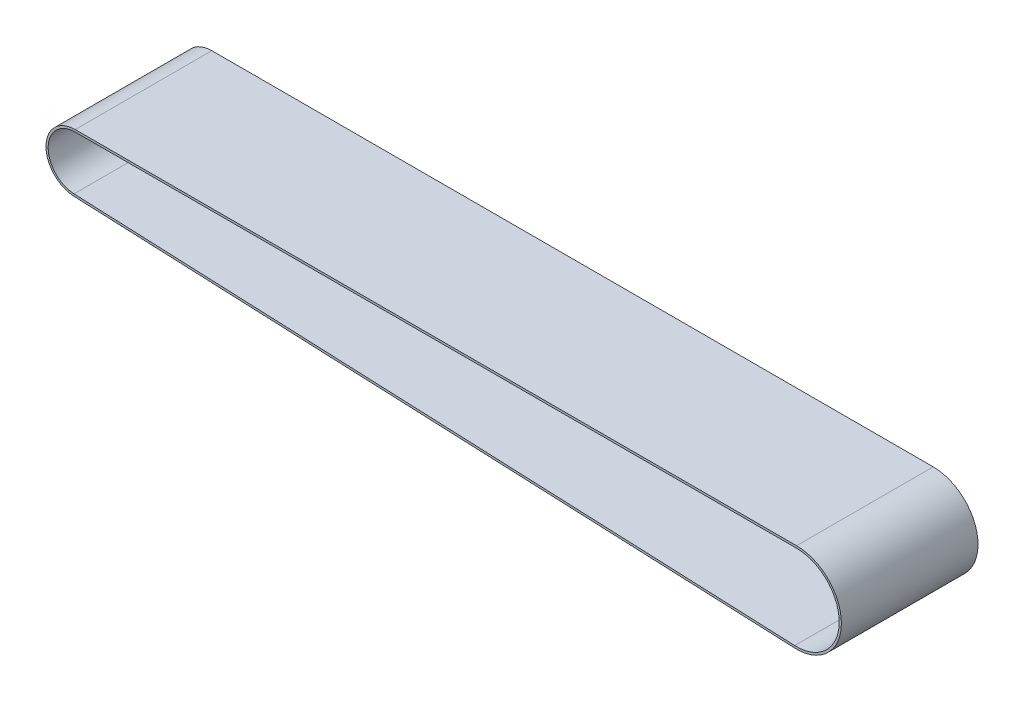
ISO-10303-21;
HEADER;
FILE_DESCRIPTION(('STEP AP214'),'2;1');
FILE_NAME('part.step','',(''),(''),'','','');
FILE_SCHEMA(('AUTOMOTIVE_DESIGN { 1 0 10303 214 1 1 1 1 }'));
ENDSEC;
DATA;
#1=APPLICATION_CONTEXT('core data for automotive mechanical design processes');
#2=APPLICATION_PROTOCOL_DEFINITION('international standard','automotive_design',2000,#1);
#3=PRODUCT_CONTEXT('',#1,'mechanical');
#4=PRODUCT('Part','Part','',(#3));
#5=PRODUCT_RELATED_PRODUCT_CATEGORY('part','',(#4));
#6=PRODUCT_DEFINITION_FORMATION('','',#4);
#7=PRODUCT_DEFINITION_CONTEXT('part definition',#1,'design');
#8=PRODUCT_DEFINITION('design','',#6,#7);
#9=PRODUCT_DEFINITION_SHAPE('','',#8);
#10=(LENGTH_UNIT() NAMED_UNIT(*) SI_UNIT(.MILLI.,.METRE.));
#11=(NAMED_UNIT(*) PLANE_ANGLE_UNIT() SI_UNIT($,.RADIAN.));
#12=(NAMED_UNIT(*) SI_UNIT($,.STERADIAN.) SOLID_ANGLE_UNIT());
#13=UNCERTAINTY_MEASURE_WITH_UNIT(LENGTH_MEASURE(1.E-05),#10,'distance_accuracy_value','');
#14=(GEOMETRIC_REPRESENTATION_CONTEXT(3) GLOBAL_UNCERTAINTY_ASSIGNED_CONTEXT((#13)) GLOBAL_UNIT_ASSIGNED_CONTEXT((#10,
#11,#12)) REPRESENTATION_CONTEXT('',''));
#15=CARTESIAN_POINT('',(0.,0.,0.));
#16=DIRECTION('',(0.,0.,1.));
#17=DIRECTION('',(1.,0.,0.));
#18=AXIS2_PLACEMENT_3D('',#15,#16,#17);
#19=CARTESIAN_POINT('',(-3.27546878509111E-08,6.84001466577655E-12,62.5));
#20=DIRECTION('',(0.,0.,-1.));
#21=DIRECTION('',(-1.,0.,0.));
#22=AXIS2_PLACEMENT_3D('',#19,#20,#21);
#23=CYLINDRICAL_SURFACE('',#22,26.75);
#24=CARTESIAN_POINT('',(-3.27546878509111E-08,6.84001466577655E-12,-62.5));
#25=DIRECTION('',(0.,0.,-1.));
#26=DIRECTION('',(-1.,0.,0.));
#27=AXIS2_PLACEMENT_3D('',#24,#25,#26);
#28=CIRCLE('',#27,26.75);
#29=CARTESIAN_POINT('',(-1.14446153825287,-26.7255066904646,-62.5));
#30=VERTEX_POINT('',#29);
#31=CARTESIAN_POINT('',(-0.0101326492200648,26.7499980809429,-62.5));
#32=VERTEX_POINT('',#31);
#33=EDGE_CURVE('E157',#30,#32,#28,.T.);
#34=ORIENTED_EDGE('',*,*,#33,.F.);
#35=DIRECTION('',(0.,0.,-1.));
#36=VECTOR('',#35,1.);
#37=CARTESIAN_POINT('',(-1.14446153825287,-26.7255066904646,62.5));
#38=LINE('',#37,#36);
#39=CARTESIAN_POINT('',(-1.14446153825287,-26.7255066904646,62.5));
#40=VERTEX_POINT('',#39);
#41=EDGE_CURVE('E12',#40,#30,#38,.T.);
#42=ORIENTED_EDGE('',*,*,#41,.F.);
#43=CARTESIAN_POINT('',(-3.27546878509111E-08,6.84001466577655E-12,62.5));
#44=DIRECTION('',(0.,0.,-1.));
#45=DIRECTION('',(-1.,0.,0.));
#46=AXIS2_PLACEMENT_3D('',#43,#44,#45);
#47=CIRCLE('',#46,26.75);
#48=CARTESIAN_POINT('',(-0.0101326492200648,26.7499980809429,62.5));
#49=VERTEX_POINT('',#48);
#50=EDGE_CURVE('E161',#40,#49,#47,.T.);
#51=ORIENTED_EDGE('',*,*,#50,.T.);
#52=DIRECTION('',(0.,0.,-1.));
#53=VECTOR('',#52,1.);
#54=CARTESIAN_POINT('',(-0.0101326492200648,26.7499980809429,62.5));
#55=LINE('',#54,#53);
#56=EDGE_CURVE('E62',#49,#32,#55,.T.);
#57=ORIENTED_EDGE('',*,*,#56,.T.);
#58=EDGE_LOOP('',(#34,#42,#51,#57));
#59=FACE_BOUND('',#58,.T.);
#60=ADVANCED_FACE('F59',(#59),#23,.T.);
#61=CARTESIAN_POINT('',(-1.14446153825246,-26.7255066904646,62.5));
#62=DIRECTION('',(-0.0427836076821599,-0.999084362260615,0.));
#63=DIRECTION('',(0.999084362260615,-0.0427836076821599,0.));
#64=AXIS2_PLACEMENT_3D('',#61,#62,#63);
#65=PLANE('',#64);
#66=DIRECTION('',(-0.999084362260615,0.0427836076821599,0.));
#67=VECTOR('',#66,1.);
#68=CARTESIAN_POINT('',(-1.14446153825246,-26.7255066904646,-62.5));
#69=LINE('',#68,#67);
#70=CARTESIAN_POINT('',(658.245872085031,-54.9624588526566,-62.5));
#71=VERTEX_POINT('',#70);
#72=EDGE_CURVE('E165',#71,#30,#69,.T.);
#73=ORIENTED_EDGE('',*,*,#72,.F.);
#74=DIRECTION('',(0.,0.,-1.));
#75=VECTOR('',#74,1.);
#76=CARTESIAN_POINT('',(658.245872085031,-54.9624588526566,62.5));
#77=LINE('',#76,#75);
#78=CARTESIAN_POINT('',(658.245872085031,-54.9624588526566,62.5));
#79=VERTEX_POINT('',#78);
#80=EDGE_CURVE('E67',#79,#71,#77,.T.);
#81=ORIENTED_EDGE('',*,*,#80,.F.);
#82=DIRECTION('',(-0.999084362260615,0.0427836076821599,0.));
#83=VECTOR('',#82,1.);
#84=CARTESIAN_POINT('',(-1.14446153825246,-26.7255066904646,62.5));
#85=LINE('',#84,#83);
#86=EDGE_CURVE('E171',#79,#40,#85,.T.);
#87=ORIENTED_EDGE('',*,*,#86,.T.);
#88=ORIENTED_EDGE('',*,*,#41,.T.);
#89=EDGE_LOOP('',(#73,#81,#87,#88));
#90=FACE_BOUND('',#89,.T.);
#91=ADVANCED_FACE('F197',(#90),#65,.T.);
#92=CARTESIAN_POINT('',(660.,-13.9999999999714,62.5));
#93=DIRECTION('',(0.,0.,-1.));
#94=DIRECTION('',(-1.,0.,0.));
#95=AXIS2_PLACEMENT_3D('',#92,#93,#94);
#96=CYLINDRICAL_SURFACE('',#95,41.);
#97=CARTESIAN_POINT('',(660.,-13.9999999999714,-62.5));
#98=DIRECTION('',(0.,0.,-1.));
#99=DIRECTION('',(-1.,0.,0.));
#100=AXIS2_PLACEMENT_3D('',#97,#98,#99);
#101=CIRCLE('',#100,41.);
#102=CARTESIAN_POINT('',(659.984469634576,26.9999970586597,-62.5));
#103=VERTEX_POINT('',#102);
#104=EDGE_CURVE('E179',#103,#71,#101,.T.);
#105=ORIENTED_EDGE('',*,*,#104,.F.);
#106=DIRECTION('',(0.,0.,-1.));
#107=VECTOR('',#106,1.);
#108=CARTESIAN_POINT('',(659.984469634576,26.9999970586597,62.5));
#109=LINE('',#108,#107);
#110=CARTESIAN_POINT('',(659.984469634576,26.9999970586597,62.5));
#111=VERTEX_POINT('',#110);
#112=EDGE_CURVE('E184',#111,#103,#109,.T.);
#113=ORIENTED_EDGE('',*,*,#112,.F.);
#114=CARTESIAN_POINT('',(660.,-13.9999999999714,62.5));
#115=DIRECTION('',(0.,0.,-1.));
#116=DIRECTION('',(-1.,0.,0.));
#117=AXIS2_PLACEMENT_3D('',#114,#115,#116);
#118=CIRCLE('',#117,41.);
#119=EDGE_CURVE('E168',#111,#79,#118,.T.);
#120=ORIENTED_EDGE('',*,*,#119,.T.);
#121=ORIENTED_EDGE('',*,*,#80,.T.);
#122=EDGE_LOOP('',(#105,#113,#120,#121));
#123=FACE_BOUND('',#122,.T.);
#124=ADVANCED_FACE('F201',(#123),#96,.T.);
#125=CARTESIAN_POINT('',(-0.0101326492200621,26.7499980809429,62.5));
#126=DIRECTION('',(-0.000378789400574739,0.999999928259293,0.));
#127=DIRECTION('',(-0.999999928259293,-0.000378789400574739,0.));
#128=AXIS2_PLACEMENT_3D('',#125,#126,#127);
#129=PLANE('',#128);
#130=DIRECTION('',(0.999999928259293,0.000378789400574739,0.));
#131=VECTOR('',#130,1.);
#132=CARTESIAN_POINT('',(-0.0101326492200621,26.7499980809429,-62.5));
#133=LINE('',#132,#131);
#134=EDGE_CURVE('E176',#32,#103,#133,.T.);
#135=ORIENTED_EDGE('',*,*,#134,.F.);
#136=ORIENTED_EDGE('',*,*,#56,.F.);
#137=DIRECTION('',(0.999999928259293,0.000378789400574739,0.));
#138=VECTOR('',#137,1.);
#139=CARTESIAN_POINT('',(-0.0101326492200621,26.7499980809429,62.5));
#140=LINE('',#139,#138);
#141=EDGE_CURVE('E164',#49,#111,#140,.T.);
#142=ORIENTED_EDGE('',*,*,#141,.T.);
#143=ORIENTED_EDGE('',*,*,#112,.T.);
#144=EDGE_LOOP('',(#135,#136,#142,#143));
#145=FACE_BOUND('',#144,.T.);
#146=ADVANCED_FACE('F192',(#145),#129,.T.);
#147=CARTESIAN_POINT('',(-3.27546878509111E-08,6.84001466577655E-12,62.5));
#148=DIRECTION('',(0.,0.,-1.));
#149=DIRECTION('',(-1.,0.,0.));
#150=AXIS2_PLACEMENT_3D('',#147,#148,#149);
#151=PLANE('',#150);
#152=DIRECTION('',(-0.999084362260615,0.0427836076821599,0.));
#153=VECTOR('',#152,1.);
#154=CARTESIAN_POINT('',(658.331439300395,-52.9642901281354,62.5));
#155=LINE('',#154,#153);
#156=CARTESIAN_POINT('',(658.331439300395,-52.9642901281354,62.5));
#157=VERTEX_POINT('',#156);
#158=CARTESIAN_POINT('',(-1.05889432288814,-24.7273379659434,62.5));
#159=VERTEX_POINT('',#158);
#160=EDGE_CURVE('E132',#157,#159,#155,.T.);
#161=ORIENTED_EDGE('',*,*,#160,.T.);
#162=CARTESIAN_POINT('',(-3.27546878509111E-08,6.84001466577655E-12,62.5));
#163=DIRECTION('',(0.,0.,-1.));
#164=DIRECTION('',(-1.,0.,0.));
#165=AXIS2_PLACEMENT_3D('',#162,#163,#164);
#166=CIRCLE('',#165,24.75);
#167=CARTESIAN_POINT('',(-0.00937507041891261,24.7499982244243,62.5));
#168=VERTEX_POINT('',#167);
#169=EDGE_CURVE('E126',#159,#168,#166,.T.);
#170=ORIENTED_EDGE('',*,*,#169,.T.);
#171=DIRECTION('',(0.999999928259293,0.000378789400574739,0.));
#172=VECTOR('',#171,1.);
#173=CARTESIAN_POINT('',(-0.00937507041891261,24.7499982244243,62.5));
#174=LINE('',#173,#172);
#175=CARTESIAN_POINT('',(659.985227213377,24.9999972021411,62.5));
#176=VERTEX_POINT('',#175);
#177=EDGE_CURVE('E135',#168,#176,#174,.T.);
#178=ORIENTED_EDGE('',*,*,#177,.T.);
#179=CARTESIAN_POINT('',(660.,-13.9999999999714,62.5));
#180=DIRECTION('',(0.,0.,-1.));
#181=DIRECTION('',(-1.,0.,0.));
#182=AXIS2_PLACEMENT_3D('',#179,#180,#181);
#183=CIRCLE('',#182,39.);
#184=EDGE_CURVE('E75',#176,#157,#183,.T.);
#185=ORIENTED_EDGE('',*,*,#184,.T.);
#186=EDGE_LOOP('',(#161,#170,#178,#185));
#187=FACE_BOUND('',#186,.T.);
#188=ORIENTED_EDGE('',*,*,#50,.F.);
#189=ORIENTED_EDGE('',*,*,#86,.F.);
#190=ORIENTED_EDGE('',*,*,#119,.F.);
#191=ORIENTED_EDGE('',*,*,#141,.F.);
#192=EDGE_LOOP('',(#188,#189,#190,#191));
#193=FACE_BOUND('',#192,.T.);
#194=ADVANCED_FACE('F139',(#187,#193),#151,.F.);
#195=CARTESIAN_POINT('',(-3.27546878509111E-08,6.84001466577655E-12,-62.5));
#196=DIRECTION('',(0.,0.,-1.));
#197=DIRECTION('',(-1.,0.,0.));
#198=AXIS2_PLACEMENT_3D('',#195,#196,#197);
#199=PLANE('',#198);
#200=CARTESIAN_POINT('',(-3.27546878509111E-08,6.84001466577655E-12,-62.5));
#201=DIRECTION('',(0.,0.,-1.));
#202=DIRECTION('',(-1.,0.,0.));
#203=AXIS2_PLACEMENT_3D('',#200,#201,#202);
#204=CIRCLE('',#203,24.75);
#205=CARTESIAN_POINT('',(-1.05889432288814,-24.7273379659434,-62.5));
#206=VERTEX_POINT('',#205);
#207=CARTESIAN_POINT('',(-0.00937507041891261,24.7499982244243,-62.5));
#208=VERTEX_POINT('',#207);
#209=EDGE_CURVE('E83',#206,#208,#204,.T.);
#210=ORIENTED_EDGE('',*,*,#209,.F.);
#211=DIRECTION('',(-0.999084362260615,0.0427836076821599,0.));
#212=VECTOR('',#211,1.);
#213=CARTESIAN_POINT('',(658.331439300395,-52.9642901281354,-62.5));
#214=LINE('',#213,#212);
#215=CARTESIAN_POINT('',(658.331439300395,-52.9642901281354,-62.5));
#216=VERTEX_POINT('',#215);
#217=EDGE_CURVE('E142',#216,#206,#214,.T.);
#218=ORIENTED_EDGE('',*,*,#217,.F.);
#219=CARTESIAN_POINT('',(660.,-13.9999999999714,-62.5));
#220=DIRECTION('',(0.,0.,-1.));
#221=DIRECTION('',(-1.,0.,0.));
#222=AXIS2_PLACEMENT_3D('',#219,#220,#221);
#223=CIRCLE('',#222,39.);
#224=CARTESIAN_POINT('',(659.985227213377,24.9999972021411,-62.5));
#225=VERTEX_POINT('',#224);
#226=EDGE_CURVE('E145',#225,#216,#223,.T.);
#227=ORIENTED_EDGE('',*,*,#226,.F.);
#228=DIRECTION('',(0.999999928259293,0.000378789400574739,0.));
#229=VECTOR('',#228,1.);
#230=CARTESIAN_POINT('',(-0.00937507041891261,24.7499982244243,-62.5));
#231=LINE('',#230,#229);
#232=EDGE_CURVE('E151',#208,#225,#231,.T.);
#233=ORIENTED_EDGE('',*,*,#232,.F.);
#234=EDGE_LOOP('',(#210,#218,#227,#233));
#235=FACE_BOUND('',#234,.T.);
#236=ORIENTED_EDGE('',*,*,#33,.T.);
#237=ORIENTED_EDGE('',*,*,#134,.T.);
#238=ORIENTED_EDGE('',*,*,#104,.T.);
#239=ORIENTED_EDGE('',*,*,#72,.T.);
#240=EDGE_LOOP('',(#236,#237,#238,#239));
#241=FACE_BOUND('',#240,.T.);
#242=ADVANCED_FACE('F194',(#235,#241),#199,.T.);
#243=CARTESIAN_POINT('',(-3.27546878509111E-08,6.84001466577655E-12,62.5));
#244=DIRECTION('',(0.,0.,-1.));
#245=DIRECTION('',(-1.,0.,0.));
#246=AXIS2_PLACEMENT_3D('',#243,#244,#245);
#247=CYLINDRICAL_SURFACE('',#246,24.75);
#248=ORIENTED_EDGE('',*,*,#209,.T.);
#249=DIRECTION('',(0.,0.,-1.));
#250=VECTOR('',#249,1.);
#251=CARTESIAN_POINT('',(-0.00937507041891261,24.7499982244243,62.5));
#252=LINE('',#251,#250);
#253=EDGE_CURVE('E122',#168,#208,#252,.T.);
#254=ORIENTED_EDGE('',*,*,#253,.F.);
#255=ORIENTED_EDGE('',*,*,#169,.F.);
#256=DIRECTION('',(0.,0.,-1.));
#257=VECTOR('',#256,1.);
#258=CARTESIAN_POINT('',(-1.05889432288814,-24.7273379659434,62.5));
#259=LINE('',#258,#257);
#260=EDGE_CURVE('E155',#159,#206,#259,.T.);
#261=ORIENTED_EDGE('',*,*,#260,.T.);
#262=EDGE_LOOP('',(#248,#254,#255,#261));
#263=FACE_BOUND('',#262,.T.);
#264=ADVANCED_FACE('F124',(#263),#247,.F.);
#265=CARTESIAN_POINT('',(658.331439300395,-52.9642901281354,62.5));
#266=DIRECTION('',(-0.0427836076821599,-0.999084362260615,0.));
#267=DIRECTION('',(0.999084362260615,-0.0427836076821599,0.));
#268=AXIS2_PLACEMENT_3D('',#265,#266,#267);
#269=PLANE('',#268);
#270=ORIENTED_EDGE('',*,*,#217,.T.);
#271=ORIENTED_EDGE('',*,*,#260,.F.);
#272=ORIENTED_EDGE('',*,*,#160,.F.);
#273=DIRECTION('',(0.,0.,-1.));
#274=VECTOR('',#273,1.);
#275=CARTESIAN_POINT('',(658.331439300395,-52.9642901281354,62.5));
#276=LINE('',#275,#274);
#277=EDGE_CURVE('E158',#157,#216,#276,.T.);
#278=ORIENTED_EDGE('',*,*,#277,.T.);
#279=EDGE_LOOP('',(#270,#271,#272,#278));
#280=FACE_BOUND('',#279,.T.);
#281=ADVANCED_FACE('F252',(#280),#269,.F.);
#282=CARTESIAN_POINT('',(660.,-13.9999999999714,62.5));
#283=DIRECTION('',(0.,0.,-1.));
#284=DIRECTION('',(-1.,0.,0.));
#285=AXIS2_PLACEMENT_3D('',#282,#283,#284);
#286=CYLINDRICAL_SURFACE('',#285,39.);
#287=ORIENTED_EDGE('',*,*,#226,.T.);
#288=ORIENTED_EDGE('',*,*,#277,.F.);
#289=ORIENTED_EDGE('',*,*,#184,.F.);
#290=DIRECTION('',(0.,0.,-1.));
#291=VECTOR('',#290,1.);
#292=CARTESIAN_POINT('',(659.985227213377,24.9999972021411,62.5));
#293=LINE('',#292,#291);
#294=EDGE_CURVE('E131',#176,#225,#293,.T.);
#295=ORIENTED_EDGE('',*,*,#294,.T.);
#296=EDGE_LOOP('',(#287,#288,#289,#295));
#297=FACE_BOUND('',#296,.T.);
#298=ADVANCED_FACE('F261',(#297),#286,.F.);
#299=CARTESIAN_POINT('',(-0.00937507041891261,24.7499982244243,62.5));
#300=DIRECTION('',(-0.000378789400574739,0.999999928259293,0.));
#301=DIRECTION('',(-0.999999928259293,-0.000378789400574739,0.));
#302=AXIS2_PLACEMENT_3D('',#299,#300,#301);
#303=PLANE('',#302);
#304=ORIENTED_EDGE('',*,*,#232,.T.);
#305=ORIENTED_EDGE('',*,*,#294,.F.);
#306=ORIENTED_EDGE('',*,*,#177,.F.);
#307=ORIENTED_EDGE('',*,*,#253,.T.);
#308=EDGE_LOOP('',(#304,#305,#306,#307));
#309=FACE_BOUND('',#308,.T.);
#310=ADVANCED_FACE('F136',(#309),#303,.F.);
#311=CLOSED_SHELL('',(#60,#91,#124,#146,#194,#242,#264,#281,#298,#310));
#312=MANIFOLD_SOLID_BREP('B2',#311);
#313=ADVANCED_BREP_SHAPE_REPRESENTATION('',(#18,#312),#14);
#314=SHAPE_DEFINITION_REPRESENTATION(#9,#313);
ENDSEC;
END-ISO-10303-21;
